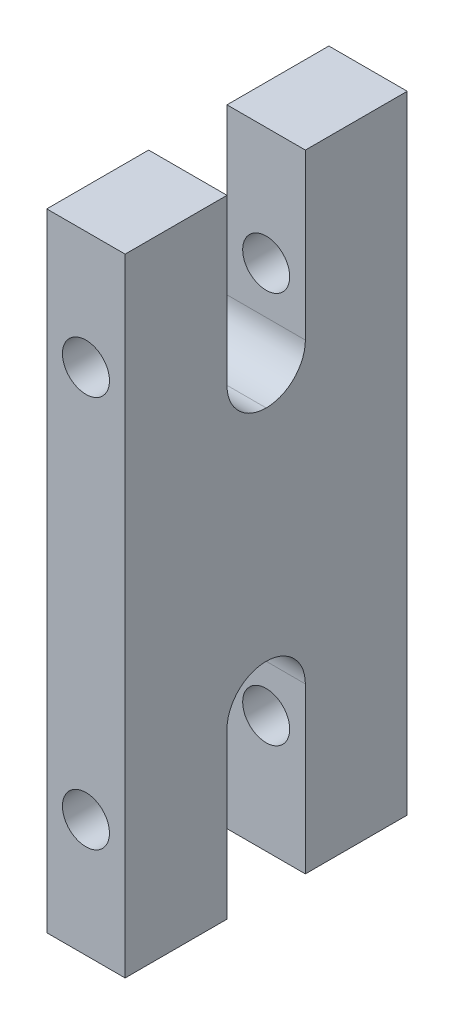
ISO-10303-21;
HEADER;
FILE_DESCRIPTION(('STEP AP214'),'2;1');
FILE_NAME('part.step','',(''),(''),'','','');
FILE_SCHEMA(('AUTOMOTIVE_DESIGN { 1 0 10303 214 1 1 1 1 }'));
ENDSEC;
DATA;
#1=APPLICATION_CONTEXT('core data for automotive mechanical design processes');
#2=APPLICATION_PROTOCOL_DEFINITION('international standard','automotive_design',2000,#1);
#3=PRODUCT_CONTEXT('',#1,'mechanical');
#4=PRODUCT('Part','Part','',(#3));
#5=PRODUCT_RELATED_PRODUCT_CATEGORY('part','',(#4));
#6=PRODUCT_DEFINITION_FORMATION('','',#4);
#7=PRODUCT_DEFINITION_CONTEXT('part definition',#1,'design');
#8=PRODUCT_DEFINITION('design','',#6,#7);
#9=PRODUCT_DEFINITION_SHAPE('','',#8);
#10=(LENGTH_UNIT() NAMED_UNIT(*) SI_UNIT(.MILLI.,.METRE.));
#11=(NAMED_UNIT(*) PLANE_ANGLE_UNIT() SI_UNIT($,.RADIAN.));
#12=(NAMED_UNIT(*) SI_UNIT($,.STERADIAN.) SOLID_ANGLE_UNIT());
#13=UNCERTAINTY_MEASURE_WITH_UNIT(LENGTH_MEASURE(1.E-05),#10,'distance_accuracy_value','');
#14=(GEOMETRIC_REPRESENTATION_CONTEXT(3) GLOBAL_UNCERTAINTY_ASSIGNED_CONTEXT((#13)) GLOBAL_UNIT_ASSIGNED_CONTEXT((#10,
#11,#12)) REPRESENTATION_CONTEXT('',''));
#15=CARTESIAN_POINT('',(0.,0.,0.));
#16=DIRECTION('',(0.,0.,1.));
#17=DIRECTION('',(1.,0.,0.));
#18=AXIS2_PLACEMENT_3D('',#15,#16,#17);
#19=CARTESIAN_POINT('',(5.,-20.,-2.5));
#20=DIRECTION('',(0.,1.,0.));
#21=DIRECTION('',(0.,0.,1.));
#22=AXIS2_PLACEMENT_3D('',#19,#20,#21);
#23=PLANE('',#22);
#24=DIRECTION('',(0.,0.,-1.));
#25=VECTOR('',#24,1.);
#26=CARTESIAN_POINT('',(0.,-20.,-2.5));
#27=LINE('',#26,#25);
#28=CARTESIAN_POINT('',(0.,-20.,-2.5));
#29=VERTEX_POINT('',#28);
#30=CARTESIAN_POINT('',(0.,-20.,-9.));
#31=VERTEX_POINT('',#30);
#32=EDGE_CURVE('E158',#29,#31,#27,.T.);
#33=ORIENTED_EDGE('',*,*,#32,.T.);
#34=DIRECTION('',(-1.,0.,0.));
#35=VECTOR('',#34,1.);
#36=CARTESIAN_POINT('',(5.,-20.,-9.));
#37=LINE('',#36,#35);
#38=CARTESIAN_POINT('',(5.,-20.,-9.));
#39=VERTEX_POINT('',#38);
#40=EDGE_CURVE('E140',#39,#31,#37,.T.);
#41=ORIENTED_EDGE('',*,*,#40,.F.);
#42=DIRECTION('',(0.,0.,-1.));
#43=VECTOR('',#42,1.);
#44=CARTESIAN_POINT('',(5.,-20.,-2.5));
#45=LINE('',#44,#43);
#46=CARTESIAN_POINT('',(5.,-20.,-2.5));
#47=VERTEX_POINT('',#46);
#48=EDGE_CURVE('E146',#47,#39,#45,.T.);
#49=ORIENTED_EDGE('',*,*,#48,.F.);
#50=DIRECTION('',(-1.,0.,0.));
#51=VECTOR('',#50,1.);
#52=CARTESIAN_POINT('',(5.,-20.,-2.5));
#53=LINE('',#52,#51);
#54=EDGE_CURVE('E228',#47,#29,#53,.T.);
#55=ORIENTED_EDGE('',*,*,#54,.T.);
#56=EDGE_LOOP('',(#33,#41,#49,#55));
#57=FACE_BOUND('',#56,.T.);
#58=ADVANCED_FACE('F34',(#57),#23,.F.);
#59=CARTESIAN_POINT('',(5.,20.,-9.));
#60=DIRECTION('',(0.,0.,1.));
#61=DIRECTION('',(0.,-1.,0.));
#62=AXIS2_PLACEMENT_3D('',#59,#60,#61);
#63=PLANE('',#62);
#64=CARTESIAN_POINT('',(2.5,12.5,-9.));
#65=DIRECTION('',(0.,0.,1.));
#66=DIRECTION('',(0.,-1.,0.));
#67=AXIS2_PLACEMENT_3D('',#64,#65,#66);
#68=CIRCLE('',#67,1.5);
#69=CARTESIAN_POINT('',(2.5,11.,-9.));
#70=VERTEX_POINT('',#69);
#71=EDGE_CURVE('E231',#70,#70,#68,.T.);
#72=ORIENTED_EDGE('',*,*,#71,.T.);
#73=EDGE_LOOP('',(#72));
#74=FACE_BOUND('',#73,.T.);
#75=CARTESIAN_POINT('',(2.5,-12.5,-9.));
#76=DIRECTION('',(0.,0.,1.));
#77=DIRECTION('',(0.,-1.,0.));
#78=AXIS2_PLACEMENT_3D('',#75,#76,#77);
#79=CIRCLE('',#78,1.5);
#80=CARTESIAN_POINT('',(2.5,-14.,-9.));
#81=VERTEX_POINT('',#80);
#82=EDGE_CURVE('E279',#81,#81,#79,.T.);
#83=ORIENTED_EDGE('',*,*,#82,.T.);
#84=EDGE_LOOP('',(#83));
#85=FACE_BOUND('',#84,.T.);
#86=DIRECTION('',(0.,1.,0.));
#87=VECTOR('',#86,1.);
#88=CARTESIAN_POINT('',(0.,20.,-9.));
#89=LINE('',#88,#87);
#90=CARTESIAN_POINT('',(0.,20.,-9.));
#91=VERTEX_POINT('',#90);
#92=EDGE_CURVE('E230',#31,#91,#89,.T.);
#93=ORIENTED_EDGE('',*,*,#92,.T.);
#94=DIRECTION('',(-1.,0.,0.));
#95=VECTOR('',#94,1.);
#96=CARTESIAN_POINT('',(5.,20.,-9.));
#97=LINE('',#96,#95);
#98=CARTESIAN_POINT('',(5.,20.,-9.));
#99=VERTEX_POINT('',#98);
#100=EDGE_CURVE('E143',#99,#91,#97,.T.);
#101=ORIENTED_EDGE('',*,*,#100,.F.);
#102=DIRECTION('',(0.,1.,0.));
#103=VECTOR('',#102,1.);
#104=CARTESIAN_POINT('',(5.,20.,-9.));
#105=LINE('',#104,#103);
#106=EDGE_CURVE('E136',#39,#99,#105,.T.);
#107=ORIENTED_EDGE('',*,*,#106,.F.);
#108=ORIENTED_EDGE('',*,*,#40,.T.);
#109=EDGE_LOOP('',(#93,#101,#107,#108));
#110=FACE_BOUND('',#109,.T.);
#111=ADVANCED_FACE('F138',(#74,#85,#110),#63,.F.);
#112=CARTESIAN_POINT('',(5.,20.,-2.5));
#113=DIRECTION('',(0.,-1.,0.));
#114=DIRECTION('',(0.,0.,-1.));
#115=AXIS2_PLACEMENT_3D('',#112,#113,#114);
#116=PLANE('',#115);
#117=DIRECTION('',(0.,0.,1.));
#118=VECTOR('',#117,1.);
#119=CARTESIAN_POINT('',(0.,20.,-2.5));
#120=LINE('',#119,#118);
#121=CARTESIAN_POINT('',(0.,20.,-2.5));
#122=VERTEX_POINT('',#121);
#123=EDGE_CURVE('E233',#91,#122,#120,.T.);
#124=ORIENTED_EDGE('',*,*,#123,.T.);
#125=DIRECTION('',(-1.,0.,0.));
#126=VECTOR('',#125,1.);
#127=CARTESIAN_POINT('',(5.,20.,-2.5));
#128=LINE('',#127,#126);
#129=CARTESIAN_POINT('',(5.,20.,-2.5));
#130=VERTEX_POINT('',#129);
#131=EDGE_CURVE('E164',#130,#122,#128,.T.);
#132=ORIENTED_EDGE('',*,*,#131,.F.);
#133=DIRECTION('',(0.,0.,1.));
#134=VECTOR('',#133,1.);
#135=CARTESIAN_POINT('',(5.,20.,-2.5));
#136=LINE('',#135,#134);
#137=EDGE_CURVE('E145',#99,#130,#136,.T.);
#138=ORIENTED_EDGE('',*,*,#137,.F.);
#139=ORIENTED_EDGE('',*,*,#100,.T.);
#140=EDGE_LOOP('',(#124,#132,#138,#139));
#141=FACE_BOUND('',#140,.T.);
#142=ADVANCED_FACE('F269',(#141),#116,.F.);
#143=CARTESIAN_POINT('',(5.,7.,-2.5));
#144=DIRECTION('',(0.,0.,-1.));
#145=DIRECTION('',(-1.,0.,0.));
#146=AXIS2_PLACEMENT_3D('',#143,#144,#145);
#147=PLANE('',#146);
#148=CARTESIAN_POINT('',(2.5,12.5,-2.5));
#149=DIRECTION('',(0.,0.,-1.));
#150=DIRECTION('',(-1.,0.,0.));
#151=AXIS2_PLACEMENT_3D('',#148,#149,#150);
#152=CIRCLE('',#151,1.5);
#153=CARTESIAN_POINT('',(0.999999999999999,12.5,-2.5));
#154=VERTEX_POINT('',#153);
#155=EDGE_CURVE('E273',#154,#154,#152,.T.);
#156=ORIENTED_EDGE('',*,*,#155,.T.);
#157=EDGE_LOOP('',(#156));
#158=FACE_BOUND('',#157,.T.);
#159=DIRECTION('',(0.,-1.,0.));
#160=VECTOR('',#159,1.);
#161=CARTESIAN_POINT('',(0.,7.,-2.5));
#162=LINE('',#161,#160);
#163=CARTESIAN_POINT('',(0.,9.5,-2.5));
#164=VERTEX_POINT('',#163);
#165=EDGE_CURVE('E235',#122,#164,#162,.T.);
#166=ORIENTED_EDGE('',*,*,#165,.T.);
#167=DIRECTION('',(-1.,0.,0.));
#168=VECTOR('',#167,1.);
#169=CARTESIAN_POINT('',(5.,9.5,-2.5));
#170=LINE('',#169,#168);
#171=CARTESIAN_POINT('',(5.,9.5,-2.5));
#172=VERTEX_POINT('',#171);
#173=EDGE_CURVE('E174',#164,#172,#170,.F.);
#174=ORIENTED_EDGE('',*,*,#173,.T.);
#175=DIRECTION('',(0.,-1.,0.));
#176=VECTOR('',#175,1.);
#177=CARTESIAN_POINT('',(5.,7.,-2.5));
#178=LINE('',#177,#176);
#179=EDGE_CURVE('E214',#130,#172,#178,.T.);
#180=ORIENTED_EDGE('',*,*,#179,.F.);
#181=ORIENTED_EDGE('',*,*,#131,.T.);
#182=EDGE_LOOP('',(#166,#174,#180,#181));
#183=FACE_BOUND('',#182,.T.);
#184=ADVANCED_FACE('F265',(#158,#183),#147,.F.);
#185=CARTESIAN_POINT('',(5.,20.,2.5));
#186=DIRECTION('',(0.,0.,1.));
#187=DIRECTION('',(0.,-1.,0.));
#188=AXIS2_PLACEMENT_3D('',#185,#186,#187);
#189=PLANE('',#188);
#190=CARTESIAN_POINT('',(2.5,12.5,2.5));
#191=DIRECTION('',(0.,0.,1.));
#192=DIRECTION('',(0.,-1.,0.));
#193=AXIS2_PLACEMENT_3D('',#190,#191,#192);
#194=CIRCLE('',#193,1.5);
#195=CARTESIAN_POINT('',(2.5,11.,2.5));
#196=VERTEX_POINT('',#195);
#197=EDGE_CURVE('E276',#196,#196,#194,.T.);
#198=ORIENTED_EDGE('',*,*,#197,.T.);
#199=EDGE_LOOP('',(#198));
#200=FACE_BOUND('',#199,.T.);
#201=DIRECTION('',(0.,1.,0.));
#202=VECTOR('',#201,1.);
#203=CARTESIAN_POINT('',(5.,20.,2.5));
#204=LINE('',#203,#202);
#205=CARTESIAN_POINT('',(5.,9.50000000000001,2.5));
#206=VERTEX_POINT('',#205);
#207=CARTESIAN_POINT('',(5.,20.,2.5));
#208=VERTEX_POINT('',#207);
#209=EDGE_CURVE('E206',#206,#208,#204,.T.);
#210=ORIENTED_EDGE('',*,*,#209,.F.);
#211=DIRECTION('',(-1.,0.,0.));
#212=VECTOR('',#211,1.);
#213=CARTESIAN_POINT('',(0.,9.5,2.5));
#214=LINE('',#213,#212);
#215=CARTESIAN_POINT('',(0.,9.50000000000001,2.5));
#216=VERTEX_POINT('',#215);
#217=EDGE_CURVE('E177',#206,#216,#214,.T.);
#218=ORIENTED_EDGE('',*,*,#217,.T.);
#219=DIRECTION('',(0.,1.,0.));
#220=VECTOR('',#219,1.);
#221=CARTESIAN_POINT('',(0.,20.,2.5));
#222=LINE('',#221,#220);
#223=CARTESIAN_POINT('',(0.,20.,2.5));
#224=VERTEX_POINT('',#223);
#225=EDGE_CURVE('E238',#216,#224,#222,.T.);
#226=ORIENTED_EDGE('',*,*,#225,.T.);
#227=DIRECTION('',(-1.,0.,0.));
#228=VECTOR('',#227,1.);
#229=CARTESIAN_POINT('',(5.,20.,2.5));
#230=LINE('',#229,#228);
#231=EDGE_CURVE('E211',#208,#224,#230,.T.);
#232=ORIENTED_EDGE('',*,*,#231,.F.);
#233=EDGE_LOOP('',(#210,#218,#226,#232));
#234=FACE_BOUND('',#233,.T.);
#235=ADVANCED_FACE('F209',(#200,#234),#189,.F.);
#236=CARTESIAN_POINT('',(5.,20.,9.));
#237=DIRECTION('',(0.,-1.,0.));
#238=DIRECTION('',(0.,0.,-1.));
#239=AXIS2_PLACEMENT_3D('',#236,#237,#238);
#240=PLANE('',#239);
#241=DIRECTION('',(0.,0.,1.));
#242=VECTOR('',#241,1.);
#243=CARTESIAN_POINT('',(0.,20.,9.));
#244=LINE('',#243,#242);
#245=CARTESIAN_POINT('',(0.,20.,9.));
#246=VERTEX_POINT('',#245);
#247=EDGE_CURVE('E240',#224,#246,#244,.T.);
#248=ORIENTED_EDGE('',*,*,#247,.T.);
#249=DIRECTION('',(-1.,0.,0.));
#250=VECTOR('',#249,1.);
#251=CARTESIAN_POINT('',(5.,20.,9.));
#252=LINE('',#251,#250);
#253=CARTESIAN_POINT('',(5.,20.,9.));
#254=VERTEX_POINT('',#253);
#255=EDGE_CURVE('E257',#254,#246,#252,.T.);
#256=ORIENTED_EDGE('',*,*,#255,.F.);
#257=DIRECTION('',(0.,0.,1.));
#258=VECTOR('',#257,1.);
#259=CARTESIAN_POINT('',(5.,20.,9.));
#260=LINE('',#259,#258);
#261=EDGE_CURVE('E213',#208,#254,#260,.T.);
#262=ORIENTED_EDGE('',*,*,#261,.F.);
#263=ORIENTED_EDGE('',*,*,#231,.T.);
#264=EDGE_LOOP('',(#248,#256,#262,#263));
#265=FACE_BOUND('',#264,.T.);
#266=ADVANCED_FACE('F294',(#265),#240,.F.);
#267=CARTESIAN_POINT('',(5.,20.,9.));
#268=DIRECTION('',(0.,0.,-1.));
#269=DIRECTION('',(0.,1.,0.));
#270=AXIS2_PLACEMENT_3D('',#267,#268,#269);
#271=PLANE('',#270);
#272=CARTESIAN_POINT('',(2.5,12.5,9.));
#273=DIRECTION('',(0.,0.,1.));
#274=DIRECTION('',(1.,0.,0.));
#275=AXIS2_PLACEMENT_3D('',#272,#273,#274);
#276=CIRCLE('',#275,1.5);
#277=CARTESIAN_POINT('',(4.,12.5,9.));
#278=VERTEX_POINT('',#277);
#279=EDGE_CURVE('E171',#278,#278,#276,.T.);
#280=ORIENTED_EDGE('',*,*,#279,.F.);
#281=EDGE_LOOP('',(#280));
#282=FACE_BOUND('',#281,.T.);
#283=CARTESIAN_POINT('',(2.5,-12.5,9.));
#284=DIRECTION('',(0.,0.,1.));
#285=DIRECTION('',(-1.,0.,0.));
#286=AXIS2_PLACEMENT_3D('',#283,#284,#285);
#287=CIRCLE('',#286,1.5);
#288=CARTESIAN_POINT('',(0.999999999999998,-12.5,9.));
#289=VERTEX_POINT('',#288);
#290=EDGE_CURVE('E192',#289,#289,#287,.T.);
#291=ORIENTED_EDGE('',*,*,#290,.F.);
#292=EDGE_LOOP('',(#291));
#293=FACE_BOUND('',#292,.T.);
#294=DIRECTION('',(0.,-1.,0.));
#295=VECTOR('',#294,1.);
#296=CARTESIAN_POINT('',(0.,20.,9.));
#297=LINE('',#296,#295);
#298=CARTESIAN_POINT('',(0.,-20.,9.));
#299=VERTEX_POINT('',#298);
#300=EDGE_CURVE('E242',#246,#299,#297,.T.);
#301=ORIENTED_EDGE('',*,*,#300,.T.);
#302=DIRECTION('',(-1.,0.,0.));
#303=VECTOR('',#302,1.);
#304=CARTESIAN_POINT('',(5.,-20.,9.));
#305=LINE('',#304,#303);
#306=CARTESIAN_POINT('',(5.,-20.,9.));
#307=VERTEX_POINT('',#306);
#308=EDGE_CURVE('E254',#307,#299,#305,.T.);
#309=ORIENTED_EDGE('',*,*,#308,.F.);
#310=DIRECTION('',(0.,-1.,0.));
#311=VECTOR('',#310,1.);
#312=CARTESIAN_POINT('',(5.,20.,9.));
#313=LINE('',#312,#311);
#314=EDGE_CURVE('E216',#254,#307,#313,.T.);
#315=ORIENTED_EDGE('',*,*,#314,.F.);
#316=ORIENTED_EDGE('',*,*,#255,.T.);
#317=EDGE_LOOP('',(#301,#309,#315,#316));
#318=FACE_BOUND('',#317,.T.);
#319=ADVANCED_FACE('F290',(#282,#293,#318),#271,.F.);
#320=CARTESIAN_POINT('',(5.,-20.,9.));
#321=DIRECTION('',(0.,1.,0.));
#322=DIRECTION('',(0.,0.,1.));
#323=AXIS2_PLACEMENT_3D('',#320,#321,#322);
#324=PLANE('',#323);
#325=DIRECTION('',(0.,0.,-1.));
#326=VECTOR('',#325,1.);
#327=CARTESIAN_POINT('',(0.,-20.,9.));
#328=LINE('',#327,#326);
#329=CARTESIAN_POINT('',(0.,-20.,2.5));
#330=VERTEX_POINT('',#329);
#331=EDGE_CURVE('E244',#299,#330,#328,.T.);
#332=ORIENTED_EDGE('',*,*,#331,.T.);
#333=DIRECTION('',(-1.,0.,0.));
#334=VECTOR('',#333,1.);
#335=CARTESIAN_POINT('',(5.,-20.,2.5));
#336=LINE('',#335,#334);
#337=CARTESIAN_POINT('',(5.,-20.,2.5));
#338=VERTEX_POINT('',#337);
#339=EDGE_CURVE('E251',#338,#330,#336,.T.);
#340=ORIENTED_EDGE('',*,*,#339,.F.);
#341=DIRECTION('',(0.,0.,-1.));
#342=VECTOR('',#341,1.);
#343=CARTESIAN_POINT('',(5.,-20.,9.));
#344=LINE('',#343,#342);
#345=EDGE_CURVE('E222',#307,#338,#344,.T.);
#346=ORIENTED_EDGE('',*,*,#345,.F.);
#347=ORIENTED_EDGE('',*,*,#308,.T.);
#348=EDGE_LOOP('',(#332,#340,#346,#347));
#349=FACE_BOUND('',#348,.T.);
#350=ADVANCED_FACE('F293',(#349),#324,.F.);
#351=CARTESIAN_POINT('',(5.,-20.,2.5));
#352=DIRECTION('',(0.,0.,1.));
#353=DIRECTION('',(0.,-1.,0.));
#354=AXIS2_PLACEMENT_3D('',#351,#352,#353);
#355=PLANE('',#354);
#356=CARTESIAN_POINT('',(2.5,-12.5,2.5));
#357=DIRECTION('',(0.,0.,1.));
#358=DIRECTION('',(0.,-1.,0.));
#359=AXIS2_PLACEMENT_3D('',#356,#357,#358);
#360=CIRCLE('',#359,1.5);
#361=CARTESIAN_POINT('',(2.5,-14.,2.5));
#362=VERTEX_POINT('',#361);
#363=EDGE_CURVE('E170',#362,#362,#360,.T.);
#364=ORIENTED_EDGE('',*,*,#363,.T.);
#365=EDGE_LOOP('',(#364));
#366=FACE_BOUND('',#365,.T.);
#367=DIRECTION('',(0.,1.,0.));
#368=VECTOR('',#367,1.);
#369=CARTESIAN_POINT('',(0.,-20.,2.5));
#370=LINE('',#369,#368);
#371=CARTESIAN_POINT('',(0.,-9.50000000000001,2.5));
#372=VERTEX_POINT('',#371);
#373=EDGE_CURVE('E246',#330,#372,#370,.T.);
#374=ORIENTED_EDGE('',*,*,#373,.T.);
#375=DIRECTION('',(-1.,0.,0.));
#376=VECTOR('',#375,1.);
#377=CARTESIAN_POINT('',(5.,-9.5,2.5));
#378=LINE('',#377,#376);
#379=CARTESIAN_POINT('',(5.,-9.50000000000001,2.5));
#380=VERTEX_POINT('',#379);
#381=EDGE_CURVE('E162',#372,#380,#378,.F.);
#382=ORIENTED_EDGE('',*,*,#381,.T.);
#383=DIRECTION('',(0.,1.,0.));
#384=VECTOR('',#383,1.);
#385=CARTESIAN_POINT('',(5.,-20.,2.5));
#386=LINE('',#385,#384);
#387=EDGE_CURVE('E224',#338,#380,#386,.T.);
#388=ORIENTED_EDGE('',*,*,#387,.F.);
#389=ORIENTED_EDGE('',*,*,#339,.T.);
#390=EDGE_LOOP('',(#374,#382,#388,#389));
#391=FACE_BOUND('',#390,.T.);
#392=ADVANCED_FACE('F311',(#366,#391),#355,.F.);
#393=CARTESIAN_POINT('',(5.,-7.,-2.5));
#394=DIRECTION('',(0.,0.,-1.));
#395=DIRECTION('',(-1.,0.,0.));
#396=AXIS2_PLACEMENT_3D('',#393,#394,#395);
#397=PLANE('',#396);
#398=CARTESIAN_POINT('',(2.5,-12.5,-2.5));
#399=DIRECTION('',(0.,0.,-1.));
#400=DIRECTION('',(-1.,0.,0.));
#401=AXIS2_PLACEMENT_3D('',#398,#399,#400);
#402=CIRCLE('',#401,1.5);
#403=CARTESIAN_POINT('',(0.999999999999998,-12.5,-2.5));
#404=VERTEX_POINT('',#403);
#405=EDGE_CURVE('E168',#404,#404,#402,.T.);
#406=ORIENTED_EDGE('',*,*,#405,.T.);
#407=EDGE_LOOP('',(#406));
#408=FACE_BOUND('',#407,.T.);
#409=DIRECTION('',(0.,-1.,0.));
#410=VECTOR('',#409,1.);
#411=CARTESIAN_POINT('',(5.,-7.,-2.5));
#412=LINE('',#411,#410);
#413=CARTESIAN_POINT('',(5.,-9.5,-2.5));
#414=VERTEX_POINT('',#413);
#415=EDGE_CURVE('E151',#414,#47,#412,.T.);
#416=ORIENTED_EDGE('',*,*,#415,.F.);
#417=DIRECTION('',(-1.,0.,0.));
#418=VECTOR('',#417,1.);
#419=CARTESIAN_POINT('',(0.,-9.5,-2.5));
#420=LINE('',#419,#418);
#421=CARTESIAN_POINT('',(0.,-9.5,-2.5));
#422=VERTEX_POINT('',#421);
#423=EDGE_CURVE('E159',#414,#422,#420,.T.);
#424=ORIENTED_EDGE('',*,*,#423,.T.);
#425=DIRECTION('',(0.,-1.,0.));
#426=VECTOR('',#425,1.);
#427=CARTESIAN_POINT('',(0.,-7.,-2.5));
#428=LINE('',#427,#426);
#429=EDGE_CURVE('E155',#422,#29,#428,.T.);
#430=ORIENTED_EDGE('',*,*,#429,.T.);
#431=ORIENTED_EDGE('',*,*,#54,.F.);
#432=EDGE_LOOP('',(#416,#424,#430,#431));
#433=FACE_BOUND('',#432,.T.);
#434=ADVANCED_FACE('F393',(#408,#433),#397,.F.);
#435=CARTESIAN_POINT('',(5.,0.,0.));
#436=DIRECTION('',(-1.,0.,0.));
#437=DIRECTION('',(0.,0.,1.));
#438=AXIS2_PLACEMENT_3D('',#435,#436,#437);
#439=PLANE('',#438);
#440=ORIENTED_EDGE('',*,*,#48,.T.);
#441=ORIENTED_EDGE('',*,*,#106,.T.);
#442=ORIENTED_EDGE('',*,*,#137,.T.);
#443=ORIENTED_EDGE('',*,*,#179,.T.);
#444=CARTESIAN_POINT('',(5.,9.5,0.));
#445=DIRECTION('',(-1.,0.,0.));
#446=DIRECTION('',(0.,0.,1.));
#447=AXIS2_PLACEMENT_3D('',#444,#445,#446);
#448=CIRCLE('',#447,2.5);
#449=CARTESIAN_POINT('',(5.,7.,0.));
#450=VERTEX_POINT('',#449);
#451=EDGE_CURVE('E50',#172,#450,#448,.T.);
#452=ORIENTED_EDGE('',*,*,#451,.T.);
#453=CARTESIAN_POINT('',(5.,9.5,0.));
#454=DIRECTION('',(-1.,0.,0.));
#455=DIRECTION('',(0.,0.,1.));
#456=AXIS2_PLACEMENT_3D('',#453,#454,#455);
#457=CIRCLE('',#456,2.5);
#458=EDGE_CURVE('E11',#450,#206,#457,.T.);
#459=ORIENTED_EDGE('',*,*,#458,.T.);
#460=ORIENTED_EDGE('',*,*,#209,.T.);
#461=ORIENTED_EDGE('',*,*,#261,.T.);
#462=ORIENTED_EDGE('',*,*,#314,.T.);
#463=ORIENTED_EDGE('',*,*,#345,.T.);
#464=ORIENTED_EDGE('',*,*,#387,.T.);
#465=CARTESIAN_POINT('',(5.,-9.5,0.));
#466=DIRECTION('',(-1.,0.,0.));
#467=DIRECTION('',(0.,0.,1.));
#468=AXIS2_PLACEMENT_3D('',#465,#466,#467);
#469=CIRCLE('',#468,2.5);
#470=CARTESIAN_POINT('',(5.,-7.,0.));
#471=VERTEX_POINT('',#470);
#472=EDGE_CURVE('E185',#380,#471,#469,.T.);
#473=ORIENTED_EDGE('',*,*,#472,.T.);
#474=CARTESIAN_POINT('',(5.,-9.5,0.));
#475=DIRECTION('',(-1.,0.,0.));
#476=DIRECTION('',(0.,0.,1.));
#477=AXIS2_PLACEMENT_3D('',#474,#475,#476);
#478=CIRCLE('',#477,2.5);
#479=EDGE_CURVE('E181',#471,#414,#478,.T.);
#480=ORIENTED_EDGE('',*,*,#479,.T.);
#481=ORIENTED_EDGE('',*,*,#415,.T.);
#482=EDGE_LOOP('',(#440,#441,#442,#443,#452,#459,#460,#461,#462,#463,#464,#473,#480,#481));
#483=FACE_BOUND('',#482,.T.);
#484=ADVANCED_FACE('F149',(#483),#439,.F.);
#485=CARTESIAN_POINT('',(0.,0.,0.));
#486=DIRECTION('',(-1.,0.,0.));
#487=DIRECTION('',(0.,0.,1.));
#488=AXIS2_PLACEMENT_3D('',#485,#486,#487);
#489=PLANE('',#488);
#490=ORIENTED_EDGE('',*,*,#32,.F.);
#491=ORIENTED_EDGE('',*,*,#429,.F.);
#492=CARTESIAN_POINT('',(0.,-9.5,0.));
#493=DIRECTION('',(-1.,0.,0.));
#494=DIRECTION('',(0.,0.,1.));
#495=AXIS2_PLACEMENT_3D('',#492,#493,#494);
#496=CIRCLE('',#495,2.5);
#497=CARTESIAN_POINT('',(0.,-7.,0.));
#498=VERTEX_POINT('',#497);
#499=EDGE_CURVE('E179',#422,#498,#496,.F.);
#500=ORIENTED_EDGE('',*,*,#499,.T.);
#501=CARTESIAN_POINT('',(0.,-9.5,0.));
#502=DIRECTION('',(-1.,0.,0.));
#503=DIRECTION('',(0.,0.,1.));
#504=AXIS2_PLACEMENT_3D('',#501,#502,#503);
#505=CIRCLE('',#504,2.5);
#506=EDGE_CURVE('E183',#498,#372,#505,.F.);
#507=ORIENTED_EDGE('',*,*,#506,.T.);
#508=ORIENTED_EDGE('',*,*,#373,.F.);
#509=ORIENTED_EDGE('',*,*,#331,.F.);
#510=ORIENTED_EDGE('',*,*,#300,.F.);
#511=ORIENTED_EDGE('',*,*,#247,.F.);
#512=ORIENTED_EDGE('',*,*,#225,.F.);
#513=CARTESIAN_POINT('',(0.,9.5,0.));
#514=DIRECTION('',(-1.,0.,0.));
#515=DIRECTION('',(0.,0.,1.));
#516=AXIS2_PLACEMENT_3D('',#513,#514,#515);
#517=CIRCLE('',#516,2.5);
#518=CARTESIAN_POINT('',(0.,7.,0.));
#519=VERTEX_POINT('',#518);
#520=EDGE_CURVE('E43',#216,#519,#517,.F.);
#521=ORIENTED_EDGE('',*,*,#520,.T.);
#522=CARTESIAN_POINT('',(0.,9.5,0.));
#523=DIRECTION('',(-1.,0.,0.));
#524=DIRECTION('',(0.,0.,1.));
#525=AXIS2_PLACEMENT_3D('',#522,#523,#524);
#526=CIRCLE('',#525,2.5);
#527=EDGE_CURVE('E187',#519,#164,#526,.F.);
#528=ORIENTED_EDGE('',*,*,#527,.T.);
#529=ORIENTED_EDGE('',*,*,#165,.F.);
#530=ORIENTED_EDGE('',*,*,#123,.F.);
#531=ORIENTED_EDGE('',*,*,#92,.F.);
#532=EDGE_LOOP('',(#490,#491,#500,#507,#508,#509,#510,#511,#512,#521,#528,#529,#530,#531));
#533=FACE_BOUND('',#532,.T.);
#534=ADVANCED_FACE('F268',(#533),#489,.T.);
#535=CARTESIAN_POINT('',(2.5,-12.5,-12.));
#536=DIRECTION('',(0.,0.,1.));
#537=DIRECTION('',(1.,0.,0.));
#538=AXIS2_PLACEMENT_3D('',#535,#536,#537);
#539=CYLINDRICAL_SURFACE('',#538,1.5);
#540=ORIENTED_EDGE('',*,*,#405,.F.);
#541=EDGE_LOOP('',(#540));
#542=FACE_BOUND('',#541,.T.);
#543=ORIENTED_EDGE('',*,*,#82,.F.);
#544=EDGE_LOOP('',(#543));
#545=FACE_BOUND('',#544,.T.);
#546=ADVANCED_FACE('F373',(#542,#545),#539,.F.);
#547=ORIENTED_EDGE('',*,*,#290,.T.);
#548=EDGE_LOOP('',(#547));
#549=FACE_BOUND('',#548,.T.);
#550=ORIENTED_EDGE('',*,*,#363,.F.);
#551=EDGE_LOOP('',(#550));
#552=FACE_BOUND('',#551,.T.);
#553=ADVANCED_FACE('F367',(#549,#552),#539,.F.);
#554=CARTESIAN_POINT('',(2.5,12.5,-12.));
#555=DIRECTION('',(0.,0.,1.));
#556=DIRECTION('',(1.,0.,0.));
#557=AXIS2_PLACEMENT_3D('',#554,#555,#556);
#558=CYLINDRICAL_SURFACE('',#557,1.5);
#559=ORIENTED_EDGE('',*,*,#279,.T.);
#560=EDGE_LOOP('',(#559));
#561=FACE_BOUND('',#560,.T.);
#562=ORIENTED_EDGE('',*,*,#197,.F.);
#563=EDGE_LOOP('',(#562));
#564=FACE_BOUND('',#563,.T.);
#565=ADVANCED_FACE('F287',(#561,#564),#558,.F.);
#566=ORIENTED_EDGE('',*,*,#155,.F.);
#567=EDGE_LOOP('',(#566));
#568=FACE_BOUND('',#567,.T.);
#569=ORIENTED_EDGE('',*,*,#71,.F.);
#570=EDGE_LOOP('',(#569));
#571=FACE_BOUND('',#570,.T.);
#572=ADVANCED_FACE('F337',(#568,#571),#558,.F.);
#573=CARTESIAN_POINT('',(5.,-9.5,0.));
#574=DIRECTION('',(1.,0.,0.));
#575=DIRECTION('',(0.,0.,-1.));
#576=AXIS2_PLACEMENT_3D('',#573,#574,#575);
#577=CYLINDRICAL_SURFACE('',#576,2.5);
#578=DIRECTION('',(-1.,0.,0.));
#579=VECTOR('',#578,1.);
#580=CARTESIAN_POINT('',(0.,-7.,0.));
#581=LINE('',#580,#579);
#582=EDGE_CURVE('E190',#471,#498,#581,.T.);
#583=ORIENTED_EDGE('',*,*,#582,.F.);
#584=ORIENTED_EDGE('',*,*,#472,.F.);
#585=ORIENTED_EDGE('',*,*,#381,.F.);
#586=ORIENTED_EDGE('',*,*,#506,.F.);
#587=EDGE_LOOP('',(#583,#584,#585,#586));
#588=FACE_BOUND('',#587,.T.);
#589=ADVANCED_FACE('F315',(#588),#577,.F.);
#590=CARTESIAN_POINT('',(5.,-9.5,0.));
#591=DIRECTION('',(1.,0.,0.));
#592=DIRECTION('',(0.,0.,-1.));
#593=AXIS2_PLACEMENT_3D('',#590,#591,#592);
#594=CYLINDRICAL_SURFACE('',#593,2.5);
#595=ORIENTED_EDGE('',*,*,#479,.F.);
#596=ORIENTED_EDGE('',*,*,#582,.T.);
#597=ORIENTED_EDGE('',*,*,#499,.F.);
#598=ORIENTED_EDGE('',*,*,#423,.F.);
#599=EDGE_LOOP('',(#595,#596,#597,#598));
#600=FACE_BOUND('',#599,.T.);
#601=ADVANCED_FACE('F333',(#600),#594,.F.);
#602=CARTESIAN_POINT('',(5.,9.5,0.));
#603=DIRECTION('',(1.,0.,0.));
#604=DIRECTION('',(0.,0.,-1.));
#605=AXIS2_PLACEMENT_3D('',#602,#603,#604);
#606=CYLINDRICAL_SURFACE('',#605,2.5);
#607=ORIENTED_EDGE('',*,*,#217,.F.);
#608=ORIENTED_EDGE('',*,*,#458,.F.);
#609=DIRECTION('',(-1.,0.,0.));
#610=VECTOR('',#609,1.);
#611=CARTESIAN_POINT('',(5.,7.,0.));
#612=LINE('',#611,#610);
#613=EDGE_CURVE('E38',#519,#450,#612,.F.);
#614=ORIENTED_EDGE('',*,*,#613,.F.);
#615=ORIENTED_EDGE('',*,*,#520,.F.);
#616=EDGE_LOOP('',(#607,#608,#614,#615));
#617=FACE_BOUND('',#616,.T.);
#618=ADVANCED_FACE('F36',(#617),#606,.F.);
#619=CARTESIAN_POINT('',(5.,9.5,0.));
#620=DIRECTION('',(1.,0.,0.));
#621=DIRECTION('',(0.,0.,-1.));
#622=AXIS2_PLACEMENT_3D('',#619,#620,#621);
#623=CYLINDRICAL_SURFACE('',#622,2.5);
#624=ORIENTED_EDGE('',*,*,#451,.F.);
#625=ORIENTED_EDGE('',*,*,#173,.F.);
#626=ORIENTED_EDGE('',*,*,#527,.F.);
#627=ORIENTED_EDGE('',*,*,#613,.T.);
#628=EDGE_LOOP('',(#624,#625,#626,#627));
#629=FACE_BOUND('',#628,.T.);
#630=ADVANCED_FACE('F201',(#629),#623,.F.);
#631=CLOSED_SHELL('',(#58,#111,#142,#184,#235,#266,#319,#350,#392,#434,#484,#534,#546,#553,#565,
#572,#589,#601,#618,#630));
#632=MANIFOLD_SOLID_BREP('B2',#631);
#633=ADVANCED_BREP_SHAPE_REPRESENTATION('',(#18,#632),#14);
#634=SHAPE_DEFINITION_REPRESENTATION(#9,#633);
ENDSEC;
END-ISO-10303-21;
